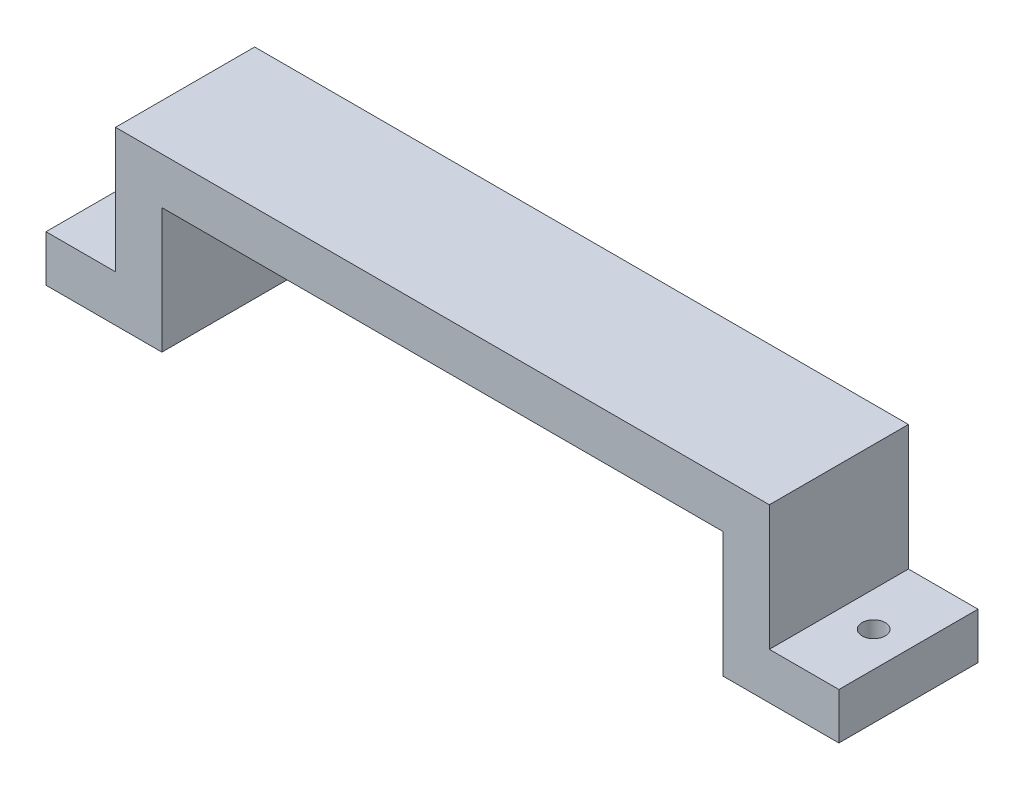
ISO-10303-21;
HEADER;
FILE_DESCRIPTION(('STEP AP214'),'2;1');
FILE_NAME('part.step','',(''),(''),'','','');
FILE_SCHEMA(('AUTOMOTIVE_DESIGN { 1 0 10303 214 1 1 1 1 }'));
ENDSEC;
DATA;
#1=APPLICATION_CONTEXT('core data for automotive mechanical design processes');
#2=APPLICATION_PROTOCOL_DEFINITION('international standard','automotive_design',2000,#1);
#3=PRODUCT_CONTEXT('',#1,'mechanical');
#4=PRODUCT('Part','Part','',(#3));
#5=PRODUCT_RELATED_PRODUCT_CATEGORY('part','',(#4));
#6=PRODUCT_DEFINITION_FORMATION('','',#4);
#7=PRODUCT_DEFINITION_CONTEXT('part definition',#1,'design');
#8=PRODUCT_DEFINITION('design','',#6,#7);
#9=PRODUCT_DEFINITION_SHAPE('','',#8);
#10=(LENGTH_UNIT() NAMED_UNIT(*) SI_UNIT(.MILLI.,.METRE.));
#11=(NAMED_UNIT(*) PLANE_ANGLE_UNIT() SI_UNIT($,.RADIAN.));
#12=(NAMED_UNIT(*) SI_UNIT($,.STERADIAN.) SOLID_ANGLE_UNIT());
#13=UNCERTAINTY_MEASURE_WITH_UNIT(LENGTH_MEASURE(1.E-05),#10,'distance_accuracy_value','');
#14=(GEOMETRIC_REPRESENTATION_CONTEXT(3) GLOBAL_UNCERTAINTY_ASSIGNED_CONTEXT((#13)) GLOBAL_UNIT_ASSIGNED_CONTEXT((#10,
#11,#12)) REPRESENTATION_CONTEXT('',''));
#15=CARTESIAN_POINT('',(0.,0.,0.));
#16=DIRECTION('',(0.,0.,1.));
#17=DIRECTION('',(1.,0.,0.));
#18=AXIS2_PLACEMENT_3D('',#15,#16,#17);
#19=CARTESIAN_POINT('',(0.,27.,-15.));
#20=DIRECTION('',(0.,-1.,0.));
#21=DIRECTION('',(1.,0.,0.));
#22=AXIS2_PLACEMENT_3D('',#19,#20,#21);
#23=PLANE('',#22);
#24=DIRECTION('',(1.,0.,0.));
#25=VECTOR('',#24,1.);
#26=CARTESIAN_POINT('',(0.,27.,-15.));
#27=LINE('',#26,#25);
#28=CARTESIAN_POINT('',(-60.5,27.,-15.));
#29=VERTEX_POINT('',#28);
#30=CARTESIAN_POINT('',(60.5,27.,-15.));
#31=VERTEX_POINT('',#30);
#32=EDGE_CURVE('E216',#29,#31,#27,.T.);
#33=ORIENTED_EDGE('',*,*,#32,.T.);
#34=DIRECTION('',(0.,0.,1.));
#35=VECTOR('',#34,1.);
#36=CARTESIAN_POINT('',(60.5,27.,-15.));
#37=LINE('',#36,#35);
#38=CARTESIAN_POINT('',(60.5,27.,15.));
#39=VERTEX_POINT('',#38);
#40=EDGE_CURVE('E144',#31,#39,#37,.T.);
#41=ORIENTED_EDGE('',*,*,#40,.T.);
#42=DIRECTION('',(1.,0.,0.));
#43=VECTOR('',#42,1.);
#44=CARTESIAN_POINT('',(0.,27.,15.));
#45=LINE('',#44,#43);
#46=CARTESIAN_POINT('',(-60.5,27.,15.));
#47=VERTEX_POINT('',#46);
#48=EDGE_CURVE('E191',#47,#39,#45,.T.);
#49=ORIENTED_EDGE('',*,*,#48,.F.);
#50=DIRECTION('',(0.,0.,1.));
#51=VECTOR('',#50,1.);
#52=CARTESIAN_POINT('',(-60.5,27.,-15.));
#53=LINE('',#52,#51);
#54=EDGE_CURVE('E11',#29,#47,#53,.T.);
#55=ORIENTED_EDGE('',*,*,#54,.F.);
#56=EDGE_LOOP('',(#33,#41,#49,#55));
#57=FACE_BOUND('',#56,.T.);
#58=ADVANCED_FACE('F44',(#57),#23,.T.);
#59=CARTESIAN_POINT('',(-60.5,0.,-15.));
#60=DIRECTION('',(1.,0.,0.));
#61=DIRECTION('',(0.,0.,-1.));
#62=AXIS2_PLACEMENT_3D('',#59,#60,#61);
#63=PLANE('',#62);
#64=ORIENTED_EDGE('',*,*,#54,.T.);
#65=DIRECTION('',(0.,1.,0.));
#66=VECTOR('',#65,1.);
#67=CARTESIAN_POINT('',(-60.5,0.,15.));
#68=LINE('',#67,#66);
#69=CARTESIAN_POINT('',(-60.5,0.,15.));
#70=VERTEX_POINT('',#69);
#71=EDGE_CURVE('E190',#70,#47,#68,.T.);
#72=ORIENTED_EDGE('',*,*,#71,.F.);
#73=DIRECTION('',(0.,0.,1.));
#74=VECTOR('',#73,1.);
#75=CARTESIAN_POINT('',(-60.5,0.,-15.));
#76=LINE('',#75,#74);
#77=CARTESIAN_POINT('',(-60.5,0.,-15.));
#78=VERTEX_POINT('',#77);
#79=EDGE_CURVE('E54',#78,#70,#76,.T.);
#80=ORIENTED_EDGE('',*,*,#79,.F.);
#81=DIRECTION('',(0.,1.,0.));
#82=VECTOR('',#81,1.);
#83=CARTESIAN_POINT('',(-60.5,0.,-15.));
#84=LINE('',#83,#82);
#85=EDGE_CURVE('E213',#78,#29,#84,.T.);
#86=ORIENTED_EDGE('',*,*,#85,.T.);
#87=EDGE_LOOP('',(#64,#72,#80,#86));
#88=FACE_BOUND('',#87,.T.);
#89=ADVANCED_FACE('F305',(#88),#63,.T.);
#90=CARTESIAN_POINT('',(-60.5,0.,-15.));
#91=DIRECTION('',(0.,-1.,0.));
#92=DIRECTION('',(0.,0.,-1.));
#93=AXIS2_PLACEMENT_3D('',#90,#91,#92);
#94=PLANE('',#93);
#95=CARTESIAN_POINT('',(-78.,0.,0.));
#96=DIRECTION('',(0.,-1.,0.));
#97=DIRECTION('',(0.,0.,-1.));
#98=AXIS2_PLACEMENT_3D('',#95,#96,#97);
#99=CIRCLE('',#98,2.5);
#100=CARTESIAN_POINT('',(-78.,0.,-2.5));
#101=VERTEX_POINT('',#100);
#102=EDGE_CURVE('E156',#101,#101,#99,.T.);
#103=ORIENTED_EDGE('',*,*,#102,.F.);
#104=EDGE_LOOP('',(#103));
#105=FACE_BOUND('',#104,.T.);
#106=ORIENTED_EDGE('',*,*,#79,.T.);
#107=DIRECTION('',(1.,0.,0.));
#108=VECTOR('',#107,1.);
#109=CARTESIAN_POINT('',(-60.5,0.,15.));
#110=LINE('',#109,#108);
#111=CARTESIAN_POINT('',(-85.5,0.,15.));
#112=VERTEX_POINT('',#111);
#113=EDGE_CURVE('E181',#112,#70,#110,.T.);
#114=ORIENTED_EDGE('',*,*,#113,.F.);
#115=DIRECTION('',(0.,0.,1.));
#116=VECTOR('',#115,1.);
#117=CARTESIAN_POINT('',(-85.5,0.,-15.));
#118=LINE('',#117,#116);
#119=CARTESIAN_POINT('',(-85.5,0.,-15.));
#120=VERTEX_POINT('',#119);
#121=EDGE_CURVE('E222',#120,#112,#118,.T.);
#122=ORIENTED_EDGE('',*,*,#121,.F.);
#123=DIRECTION('',(1.,0.,0.));
#124=VECTOR('',#123,1.);
#125=CARTESIAN_POINT('',(-60.5,0.,-15.));
#126=LINE('',#125,#124);
#127=EDGE_CURVE('E207',#120,#78,#126,.T.);
#128=ORIENTED_EDGE('',*,*,#127,.T.);
#129=EDGE_LOOP('',(#106,#114,#122,#128));
#130=FACE_BOUND('',#129,.T.);
#131=ADVANCED_FACE('F301',(#105,#130),#94,.T.);
#132=CARTESIAN_POINT('',(-85.5,0.,-15.));
#133=DIRECTION('',(-1.,0.,0.));
#134=DIRECTION('',(0.,0.,1.));
#135=AXIS2_PLACEMENT_3D('',#132,#133,#134);
#136=PLANE('',#135);
#137=ORIENTED_EDGE('',*,*,#121,.T.);
#138=DIRECTION('',(0.,-1.,0.));
#139=VECTOR('',#138,1.);
#140=CARTESIAN_POINT('',(-85.5,0.,15.));
#141=LINE('',#140,#139);
#142=CARTESIAN_POINT('',(-85.5,10.,15.));
#143=VERTEX_POINT('',#142);
#144=EDGE_CURVE('E178',#143,#112,#141,.T.);
#145=ORIENTED_EDGE('',*,*,#144,.F.);
#146=DIRECTION('',(0.,0.,1.));
#147=VECTOR('',#146,1.);
#148=CARTESIAN_POINT('',(-85.5,10.,-15.));
#149=LINE('',#148,#147);
#150=CARTESIAN_POINT('',(-85.5,10.,-15.));
#151=VERTEX_POINT('',#150);
#152=EDGE_CURVE('E221',#151,#143,#149,.T.);
#153=ORIENTED_EDGE('',*,*,#152,.F.);
#154=DIRECTION('',(0.,-1.,0.));
#155=VECTOR('',#154,1.);
#156=CARTESIAN_POINT('',(-85.5,0.,-15.));
#157=LINE('',#156,#155);
#158=EDGE_CURVE('E202',#151,#120,#157,.T.);
#159=ORIENTED_EDGE('',*,*,#158,.T.);
#160=EDGE_LOOP('',(#137,#145,#153,#159));
#161=FACE_BOUND('',#160,.T.);
#162=ADVANCED_FACE('F292',(#161),#136,.T.);
#163=CARTESIAN_POINT('',(-85.5,10.,-15.));
#164=DIRECTION('',(0.,1.,0.));
#165=DIRECTION('',(0.,0.,1.));
#166=AXIS2_PLACEMENT_3D('',#163,#164,#165);
#167=PLANE('',#166);
#168=CARTESIAN_POINT('',(-78.,10.,0.));
#169=DIRECTION('',(0.,1.,0.));
#170=DIRECTION('',(0.,0.,1.));
#171=AXIS2_PLACEMENT_3D('',#168,#169,#170);
#172=CIRCLE('',#171,2.5);
#173=CARTESIAN_POINT('',(-78.,10.,2.5));
#174=VERTEX_POINT('',#173);
#175=EDGE_CURVE('E277',#174,#174,#172,.T.);
#176=ORIENTED_EDGE('',*,*,#175,.F.);
#177=EDGE_LOOP('',(#176));
#178=FACE_BOUND('',#177,.T.);
#179=ORIENTED_EDGE('',*,*,#152,.T.);
#180=DIRECTION('',(-1.,0.,0.));
#181=VECTOR('',#180,1.);
#182=CARTESIAN_POINT('',(-85.5,10.,15.));
#183=LINE('',#182,#181);
#184=CARTESIAN_POINT('',(-70.5,10.,15.));
#185=VERTEX_POINT('',#184);
#186=EDGE_CURVE('E173',#185,#143,#183,.T.);
#187=ORIENTED_EDGE('',*,*,#186,.F.);
#188=DIRECTION('',(0.,0.,1.));
#189=VECTOR('',#188,1.);
#190=CARTESIAN_POINT('',(-70.5,10.,-15.));
#191=LINE('',#190,#189);
#192=CARTESIAN_POINT('',(-70.5,10.,-15.));
#193=VERTEX_POINT('',#192);
#194=EDGE_CURVE('E227',#193,#185,#191,.T.);
#195=ORIENTED_EDGE('',*,*,#194,.F.);
#196=DIRECTION('',(-1.,0.,0.));
#197=VECTOR('',#196,1.);
#198=CARTESIAN_POINT('',(-85.5,10.,-15.));
#199=LINE('',#198,#197);
#200=EDGE_CURVE('E203',#193,#151,#199,.T.);
#201=ORIENTED_EDGE('',*,*,#200,.T.);
#202=EDGE_LOOP('',(#179,#187,#195,#201));
#203=FACE_BOUND('',#202,.T.);
#204=ADVANCED_FACE('F287',(#178,#203),#167,.T.);
#205=CARTESIAN_POINT('',(-70.5,10.,-15.));
#206=DIRECTION('',(-1.,0.,0.));
#207=DIRECTION('',(0.,0.,1.));
#208=AXIS2_PLACEMENT_3D('',#205,#206,#207);
#209=PLANE('',#208);
#210=ORIENTED_EDGE('',*,*,#194,.T.);
#211=DIRECTION('',(0.,-1.,0.));
#212=VECTOR('',#211,1.);
#213=CARTESIAN_POINT('',(-70.5,10.,15.));
#214=LINE('',#213,#212);
#215=CARTESIAN_POINT('',(-70.5,37.,15.));
#216=VERTEX_POINT('',#215);
#217=EDGE_CURVE('E145',#216,#185,#214,.T.);
#218=ORIENTED_EDGE('',*,*,#217,.F.);
#219=DIRECTION('',(0.,0.,1.));
#220=VECTOR('',#219,1.);
#221=CARTESIAN_POINT('',(-70.5,37.,-15.));
#222=LINE('',#221,#220);
#223=CARTESIAN_POINT('',(-70.5,37.,-15.));
#224=VERTEX_POINT('',#223);
#225=EDGE_CURVE('E47',#224,#216,#222,.T.);
#226=ORIENTED_EDGE('',*,*,#225,.F.);
#227=DIRECTION('',(0.,-1.,0.));
#228=VECTOR('',#227,1.);
#229=CARTESIAN_POINT('',(-70.5,10.,-15.));
#230=LINE('',#229,#228);
#231=EDGE_CURVE('E197',#224,#193,#230,.T.);
#232=ORIENTED_EDGE('',*,*,#231,.T.);
#233=EDGE_LOOP('',(#210,#218,#226,#232));
#234=FACE_BOUND('',#233,.T.);
#235=ADVANCED_FACE('F290',(#234),#209,.T.);
#236=CARTESIAN_POINT('',(-70.5,37.,-15.));
#237=DIRECTION('',(0.,1.,0.));
#238=DIRECTION('',(-1.,0.,0.));
#239=AXIS2_PLACEMENT_3D('',#236,#237,#238);
#240=PLANE('',#239);
#241=ORIENTED_EDGE('',*,*,#225,.T.);
#242=DIRECTION('',(-1.,0.,0.));
#243=VECTOR('',#242,1.);
#244=CARTESIAN_POINT('',(-70.5,37.,15.));
#245=LINE('',#244,#243);
#246=CARTESIAN_POINT('',(70.5,37.,15.));
#247=VERTEX_POINT('',#246);
#248=EDGE_CURVE('E131',#247,#216,#245,.T.);
#249=ORIENTED_EDGE('',*,*,#248,.F.);
#250=DIRECTION('',(0.,0.,1.));
#251=VECTOR('',#250,1.);
#252=CARTESIAN_POINT('',(70.5,37.,-15.));
#253=LINE('',#252,#251);
#254=CARTESIAN_POINT('',(70.5,37.,-15.));
#255=VERTEX_POINT('',#254);
#256=EDGE_CURVE('E139',#255,#247,#253,.T.);
#257=ORIENTED_EDGE('',*,*,#256,.F.);
#258=DIRECTION('',(-1.,0.,0.));
#259=VECTOR('',#258,1.);
#260=CARTESIAN_POINT('',(-70.5,37.,-15.));
#261=LINE('',#260,#259);
#262=EDGE_CURVE('E193',#255,#224,#261,.T.);
#263=ORIENTED_EDGE('',*,*,#262,.T.);
#264=EDGE_LOOP('',(#241,#249,#257,#263));
#265=FACE_BOUND('',#264,.T.);
#266=ADVANCED_FACE('F50',(#265),#240,.T.);
#267=CARTESIAN_POINT('',(0.,0.,-15.));
#268=DIRECTION('',(0.,0.,-1.));
#269=DIRECTION('',(-1.,0.,0.));
#270=AXIS2_PLACEMENT_3D('',#267,#268,#269);
#271=PLANE('',#270);
#272=ORIENTED_EDGE('',*,*,#262,.F.);
#273=DIRECTION('',(0.,-1.,0.));
#274=VECTOR('',#273,1.);
#275=CARTESIAN_POINT('',(70.5,10.,-15.));
#276=LINE('',#275,#274);
#277=CARTESIAN_POINT('',(70.5,10.,-15.));
#278=VERTEX_POINT('',#277);
#279=EDGE_CURVE('E157',#255,#278,#276,.T.);
#280=ORIENTED_EDGE('',*,*,#279,.T.);
#281=DIRECTION('',(1.,0.,0.));
#282=VECTOR('',#281,1.);
#283=CARTESIAN_POINT('',(85.5,10.,-15.));
#284=LINE('',#283,#282);
#285=CARTESIAN_POINT('',(85.5,10.,-15.));
#286=VERTEX_POINT('',#285);
#287=EDGE_CURVE('E252',#278,#286,#284,.T.);
#288=ORIENTED_EDGE('',*,*,#287,.T.);
#289=DIRECTION('',(0.,-1.,0.));
#290=VECTOR('',#289,1.);
#291=CARTESIAN_POINT('',(85.5,0.,-15.));
#292=LINE('',#291,#290);
#293=CARTESIAN_POINT('',(85.5,0.,-15.));
#294=VERTEX_POINT('',#293);
#295=EDGE_CURVE('E248',#286,#294,#292,.T.);
#296=ORIENTED_EDGE('',*,*,#295,.T.);
#297=DIRECTION('',(-1.,0.,0.));
#298=VECTOR('',#297,1.);
#299=CARTESIAN_POINT('',(60.5,0.,-15.));
#300=LINE('',#299,#298);
#301=CARTESIAN_POINT('',(60.5,0.,-15.));
#302=VERTEX_POINT('',#301);
#303=EDGE_CURVE('E166',#294,#302,#300,.T.);
#304=ORIENTED_EDGE('',*,*,#303,.T.);
#305=DIRECTION('',(0.,1.,0.));
#306=VECTOR('',#305,1.);
#307=CARTESIAN_POINT('',(60.5,0.,-15.));
#308=LINE('',#307,#306);
#309=EDGE_CURVE('E165',#302,#31,#308,.T.);
#310=ORIENTED_EDGE('',*,*,#309,.T.);
#311=ORIENTED_EDGE('',*,*,#32,.F.);
#312=ORIENTED_EDGE('',*,*,#85,.F.);
#313=ORIENTED_EDGE('',*,*,#127,.F.);
#314=ORIENTED_EDGE('',*,*,#158,.F.);
#315=ORIENTED_EDGE('',*,*,#200,.F.);
#316=ORIENTED_EDGE('',*,*,#231,.F.);
#317=EDGE_LOOP('',(#272,#280,#288,#296,#304,#310,#311,#312,#313,#314,#315,#316));
#318=FACE_BOUND('',#317,.T.);
#319=ADVANCED_FACE('F304',(#318),#271,.T.);
#320=CARTESIAN_POINT('',(0.,0.,15.));
#321=DIRECTION('',(0.,0.,-1.));
#322=DIRECTION('',(-1.,0.,0.));
#323=AXIS2_PLACEMENT_3D('',#320,#321,#322);
#324=PLANE('',#323);
#325=ORIENTED_EDGE('',*,*,#48,.T.);
#326=DIRECTION('',(0.,1.,0.));
#327=VECTOR('',#326,1.);
#328=CARTESIAN_POINT('',(60.5,0.,15.));
#329=LINE('',#328,#327);
#330=CARTESIAN_POINT('',(60.5,0.,15.));
#331=VERTEX_POINT('',#330);
#332=EDGE_CURVE('E260',#331,#39,#329,.T.);
#333=ORIENTED_EDGE('',*,*,#332,.F.);
#334=DIRECTION('',(-1.,0.,0.));
#335=VECTOR('',#334,1.);
#336=CARTESIAN_POINT('',(60.5,0.,15.));
#337=LINE('',#336,#335);
#338=CARTESIAN_POINT('',(85.5,0.,15.));
#339=VERTEX_POINT('',#338);
#340=EDGE_CURVE('E261',#339,#331,#337,.T.);
#341=ORIENTED_EDGE('',*,*,#340,.F.);
#342=DIRECTION('',(0.,-1.,0.));
#343=VECTOR('',#342,1.);
#344=CARTESIAN_POINT('',(85.5,0.,15.));
#345=LINE('',#344,#343);
#346=CARTESIAN_POINT('',(85.5,10.,15.));
#347=VERTEX_POINT('',#346);
#348=EDGE_CURVE('E262',#347,#339,#345,.T.);
#349=ORIENTED_EDGE('',*,*,#348,.F.);
#350=DIRECTION('',(1.,0.,0.));
#351=VECTOR('',#350,1.);
#352=CARTESIAN_POINT('',(85.5,10.,15.));
#353=LINE('',#352,#351);
#354=CARTESIAN_POINT('',(70.5,10.,15.));
#355=VERTEX_POINT('',#354);
#356=EDGE_CURVE('E151',#355,#347,#353,.T.);
#357=ORIENTED_EDGE('',*,*,#356,.F.);
#358=DIRECTION('',(0.,-1.,0.));
#359=VECTOR('',#358,1.);
#360=CARTESIAN_POINT('',(70.5,10.,15.));
#361=LINE('',#360,#359);
#362=EDGE_CURVE('E146',#247,#355,#361,.T.);
#363=ORIENTED_EDGE('',*,*,#362,.F.);
#364=ORIENTED_EDGE('',*,*,#248,.T.);
#365=ORIENTED_EDGE('',*,*,#217,.T.);
#366=ORIENTED_EDGE('',*,*,#186,.T.);
#367=ORIENTED_EDGE('',*,*,#144,.T.);
#368=ORIENTED_EDGE('',*,*,#113,.T.);
#369=ORIENTED_EDGE('',*,*,#71,.T.);
#370=EDGE_LOOP('',(#325,#333,#341,#349,#357,#363,#364,#365,#366,#367,#368,#369));
#371=FACE_BOUND('',#370,.T.);
#372=ADVANCED_FACE('F149',(#371),#324,.F.);
#373=CARTESIAN_POINT('',(60.5,0.,-15.));
#374=DIRECTION('',(-1.,0.,0.));
#375=DIRECTION('',(0.,0.,-1.));
#376=AXIS2_PLACEMENT_3D('',#373,#374,#375);
#377=PLANE('',#376);
#378=ORIENTED_EDGE('',*,*,#40,.F.);
#379=ORIENTED_EDGE('',*,*,#309,.F.);
#380=DIRECTION('',(0.,0.,1.));
#381=VECTOR('',#380,1.);
#382=CARTESIAN_POINT('',(60.5,0.,-15.));
#383=LINE('',#382,#381);
#384=EDGE_CURVE('E234',#302,#331,#383,.T.);
#385=ORIENTED_EDGE('',*,*,#384,.T.);
#386=ORIENTED_EDGE('',*,*,#332,.T.);
#387=EDGE_LOOP('',(#378,#379,#385,#386));
#388=FACE_BOUND('',#387,.T.);
#389=ADVANCED_FACE('F309',(#388),#377,.T.);
#390=CARTESIAN_POINT('',(60.5,0.,-15.));
#391=DIRECTION('',(0.,-1.,0.));
#392=DIRECTION('',(0.,0.,-1.));
#393=AXIS2_PLACEMENT_3D('',#390,#391,#392);
#394=PLANE('',#393);
#395=CARTESIAN_POINT('',(78.,0.,0.));
#396=DIRECTION('',(0.,-1.,0.));
#397=DIRECTION('',(0.,0.,-1.));
#398=AXIS2_PLACEMENT_3D('',#395,#396,#397);
#399=CIRCLE('',#398,2.5);
#400=CARTESIAN_POINT('',(78.,0.,-2.5));
#401=VERTEX_POINT('',#400);
#402=EDGE_CURVE('E275',#401,#401,#399,.T.);
#403=ORIENTED_EDGE('',*,*,#402,.F.);
#404=EDGE_LOOP('',(#403));
#405=FACE_BOUND('',#404,.T.);
#406=ORIENTED_EDGE('',*,*,#384,.F.);
#407=ORIENTED_EDGE('',*,*,#303,.F.);
#408=DIRECTION('',(0.,0.,1.));
#409=VECTOR('',#408,1.);
#410=CARTESIAN_POINT('',(85.5,0.,-15.));
#411=LINE('',#410,#409);
#412=EDGE_CURVE('E240',#294,#339,#411,.T.);
#413=ORIENTED_EDGE('',*,*,#412,.T.);
#414=ORIENTED_EDGE('',*,*,#340,.T.);
#415=EDGE_LOOP('',(#406,#407,#413,#414));
#416=FACE_BOUND('',#415,.T.);
#417=ADVANCED_FACE('F316',(#405,#416),#394,.T.);
#418=CARTESIAN_POINT('',(85.5,0.,-15.));
#419=DIRECTION('',(1.,0.,0.));
#420=DIRECTION('',(0.,0.,1.));
#421=AXIS2_PLACEMENT_3D('',#418,#419,#420);
#422=PLANE('',#421);
#423=ORIENTED_EDGE('',*,*,#412,.F.);
#424=ORIENTED_EDGE('',*,*,#295,.F.);
#425=DIRECTION('',(0.,0.,1.));
#426=VECTOR('',#425,1.);
#427=CARTESIAN_POINT('',(85.5,10.,-15.));
#428=LINE('',#427,#426);
#429=EDGE_CURVE('E167',#286,#347,#428,.T.);
#430=ORIENTED_EDGE('',*,*,#429,.T.);
#431=ORIENTED_EDGE('',*,*,#348,.T.);
#432=EDGE_LOOP('',(#423,#424,#430,#431));
#433=FACE_BOUND('',#432,.T.);
#434=ADVANCED_FACE('F320',(#433),#422,.T.);
#435=CARTESIAN_POINT('',(85.5,10.,-15.));
#436=DIRECTION('',(0.,1.,0.));
#437=DIRECTION('',(0.,0.,1.));
#438=AXIS2_PLACEMENT_3D('',#435,#436,#437);
#439=PLANE('',#438);
#440=CARTESIAN_POINT('',(78.,10.,0.));
#441=DIRECTION('',(0.,1.,0.));
#442=DIRECTION('',(0.,0.,-1.));
#443=AXIS2_PLACEMENT_3D('',#440,#441,#442);
#444=CIRCLE('',#443,2.5);
#445=CARTESIAN_POINT('',(78.,10.,-2.5));
#446=VERTEX_POINT('',#445);
#447=EDGE_CURVE('E280',#446,#446,#444,.T.);
#448=ORIENTED_EDGE('',*,*,#447,.F.);
#449=EDGE_LOOP('',(#448));
#450=FACE_BOUND('',#449,.T.);
#451=ORIENTED_EDGE('',*,*,#429,.F.);
#452=ORIENTED_EDGE('',*,*,#287,.F.);
#453=DIRECTION('',(0.,0.,1.));
#454=VECTOR('',#453,1.);
#455=CARTESIAN_POINT('',(70.5,10.,-15.));
#456=LINE('',#455,#454);
#457=EDGE_CURVE('E161',#278,#355,#456,.T.);
#458=ORIENTED_EDGE('',*,*,#457,.T.);
#459=ORIENTED_EDGE('',*,*,#356,.T.);
#460=EDGE_LOOP('',(#451,#452,#458,#459));
#461=FACE_BOUND('',#460,.T.);
#462=ADVANCED_FACE('F319',(#450,#461),#439,.T.);
#463=CARTESIAN_POINT('',(70.5,10.,-15.));
#464=DIRECTION('',(1.,0.,0.));
#465=DIRECTION('',(0.,0.,1.));
#466=AXIS2_PLACEMENT_3D('',#463,#464,#465);
#467=PLANE('',#466);
#468=ORIENTED_EDGE('',*,*,#457,.F.);
#469=ORIENTED_EDGE('',*,*,#279,.F.);
#470=ORIENTED_EDGE('',*,*,#256,.T.);
#471=ORIENTED_EDGE('',*,*,#362,.T.);
#472=EDGE_LOOP('',(#468,#469,#470,#471));
#473=FACE_BOUND('',#472,.T.);
#474=ADVANCED_FACE('F158',(#473),#467,.T.);
#475=CARTESIAN_POINT('',(78.,-5.,0.));
#476=DIRECTION('',(0.,1.,0.));
#477=DIRECTION('',(0.,0.,1.));
#478=AXIS2_PLACEMENT_3D('',#475,#476,#477);
#479=CYLINDRICAL_SURFACE('',#478,2.5);
#480=ORIENTED_EDGE('',*,*,#402,.T.);
#481=EDGE_LOOP('',(#480));
#482=FACE_BOUND('',#481,.T.);
#483=ORIENTED_EDGE('',*,*,#447,.T.);
#484=EDGE_LOOP('',(#483));
#485=FACE_BOUND('',#484,.T.);
#486=ADVANCED_FACE('F328',(#482,#485),#479,.F.);
#487=CARTESIAN_POINT('',(-78.,-5.,0.));
#488=DIRECTION('',(0.,1.,0.));
#489=DIRECTION('',(0.,0.,1.));
#490=AXIS2_PLACEMENT_3D('',#487,#488,#489);
#491=CYLINDRICAL_SURFACE('',#490,2.5);
#492=ORIENTED_EDGE('',*,*,#102,.T.);
#493=EDGE_LOOP('',(#492));
#494=FACE_BOUND('',#493,.T.);
#495=ORIENTED_EDGE('',*,*,#175,.T.);
#496=EDGE_LOOP('',(#495));
#497=FACE_BOUND('',#496,.T.);
#498=ADVANCED_FACE('F283',(#494,#497),#491,.F.);
#499=CLOSED_SHELL('',(#58,#89,#131,#162,#204,#235,#266,#319,#372,#389,#417,#434,#462,#474,#486,#498));
#500=MANIFOLD_SOLID_BREP('B2',#499);
#501=ADVANCED_BREP_SHAPE_REPRESENTATION('',(#18,#500),#14);
#502=SHAPE_DEFINITION_REPRESENTATION(#9,#501);
ENDSEC;
END-ISO-10303-21;
